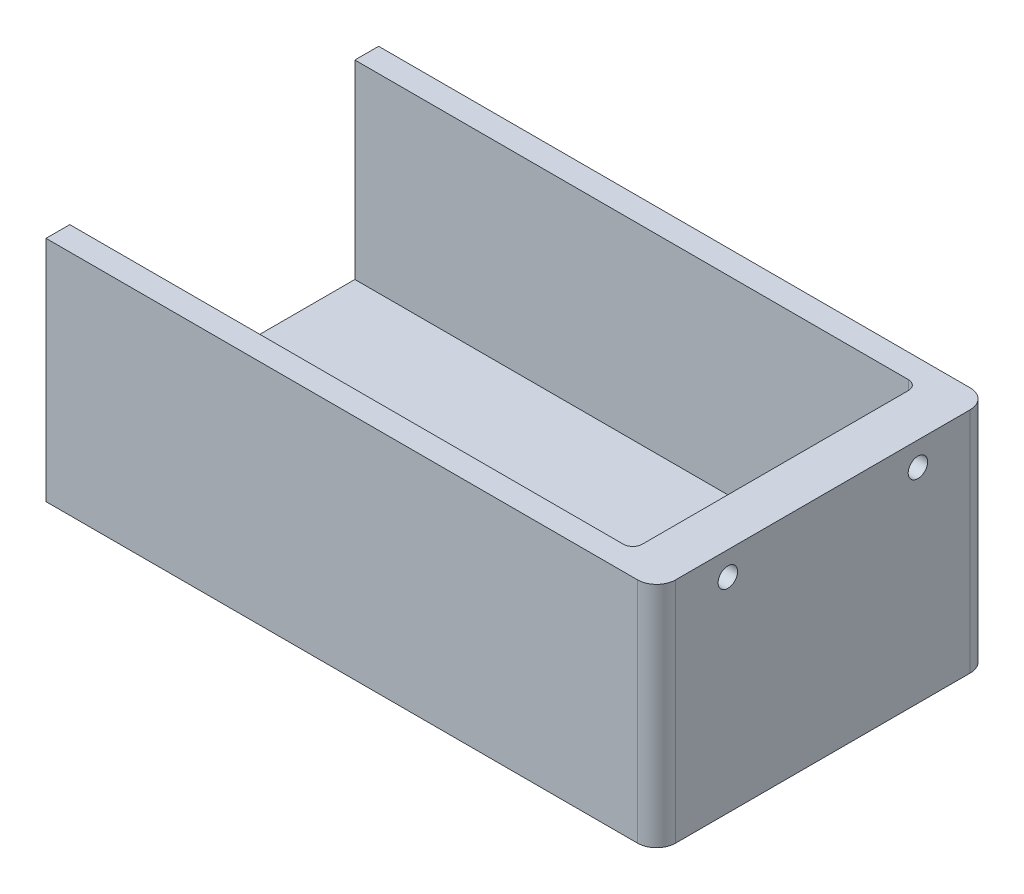
ISO-10303-21;
HEADER;
FILE_DESCRIPTION(('STEP AP214'),'2;1');
FILE_NAME('part.step','',(''),(''),'','','');
FILE_SCHEMA(('AUTOMOTIVE_DESIGN { 1 0 10303 214 1 1 1 1 }'));
ENDSEC;
DATA;
#1=APPLICATION_CONTEXT('core data for automotive mechanical design processes');
#2=APPLICATION_PROTOCOL_DEFINITION('international standard','automotive_design',2000,#1);
#3=PRODUCT_CONTEXT('',#1,'mechanical');
#4=PRODUCT('Part','Part','',(#3));
#5=PRODUCT_RELATED_PRODUCT_CATEGORY('part','',(#4));
#6=PRODUCT_DEFINITION_FORMATION('','',#4);
#7=PRODUCT_DEFINITION_CONTEXT('part definition',#1,'design');
#8=PRODUCT_DEFINITION('design','',#6,#7);
#9=PRODUCT_DEFINITION_SHAPE('','',#8);
#10=(LENGTH_UNIT() NAMED_UNIT(*) SI_UNIT(.MILLI.,.METRE.));
#11=(NAMED_UNIT(*) PLANE_ANGLE_UNIT() SI_UNIT($,.RADIAN.));
#12=(NAMED_UNIT(*) SI_UNIT($,.STERADIAN.) SOLID_ANGLE_UNIT());
#13=UNCERTAINTY_MEASURE_WITH_UNIT(LENGTH_MEASURE(1.E-05),#10,'distance_accuracy_value','');
#14=(GEOMETRIC_REPRESENTATION_CONTEXT(3) GLOBAL_UNCERTAINTY_ASSIGNED_CONTEXT((#13)) GLOBAL_UNIT_ASSIGNED_CONTEXT((#10,
#11,#12)) REPRESENTATION_CONTEXT('',''));
#15=CARTESIAN_POINT('',(0.,0.,0.));
#16=DIRECTION('',(0.,0.,1.));
#17=DIRECTION('',(1.,0.,0.));
#18=AXIS2_PLACEMENT_3D('',#15,#16,#17);
#19=CARTESIAN_POINT('',(0.,0.,0.));
#20=DIRECTION('',(1.,0.,0.));
#21=DIRECTION('',(0.,0.,-1.));
#22=AXIS2_PLACEMENT_3D('',#19,#20,#21);
#23=PLANE('',#22);
#24=CARTESIAN_POINT('',(0.,-5.08000000000003,-25.4));
#25=DIRECTION('',(-1.,0.,0.));
#26=DIRECTION('',(0.,0.,-1.));
#27=AXIS2_PLACEMENT_3D('',#24,#25,#26);
#28=CIRCLE('',#27,2.69);
#29=CARTESIAN_POINT('',(0.,-5.08000000000003,-22.71));
#30=VERTEX_POINT('',#29);
#31=EDGE_CURVE('E306',#30,#30,#28,.T.);
#32=ORIENTED_EDGE('',*,*,#31,.F.);
#33=EDGE_LOOP('',(#32));
#34=FACE_BOUND('',#33,.T.);
#35=CARTESIAN_POINT('',(0.,-5.08,25.4));
#36=DIRECTION('',(-1.,0.,0.));
#37=DIRECTION('',(0.,0.,1.));
#38=AXIS2_PLACEMENT_3D('',#35,#36,#37);
#39=CIRCLE('',#38,2.69);
#40=CARTESIAN_POINT('',(0.,-5.08,28.09));
#41=VERTEX_POINT('',#40);
#42=EDGE_CURVE('E298',#41,#41,#39,.T.);
#43=ORIENTED_EDGE('',*,*,#42,.F.);
#44=EDGE_LOOP('',(#43));
#45=FACE_BOUND('',#44,.T.);
#46=CARTESIAN_POINT('',(0.,-5.08,0.));
#47=DIRECTION('',(-1.,0.,0.));
#48=DIRECTION('',(0.,0.,1.));
#49=AXIS2_PLACEMENT_3D('',#46,#47,#48);
#50=CIRCLE('',#49,2.69);
#51=CARTESIAN_POINT('',(0.,-5.08,2.69));
#52=VERTEX_POINT('',#51);
#53=EDGE_CURVE('E294',#52,#52,#50,.T.);
#54=ORIENTED_EDGE('',*,*,#53,.F.);
#55=EDGE_LOOP('',(#54));
#56=FACE_BOUND('',#55,.T.);
#57=DIRECTION('',(0.,1.,0.));
#58=VECTOR('',#57,1.);
#59=CARTESIAN_POINT('',(0.,50.8,-38.0999999999999));
#60=LINE('',#59,#58);
#61=CARTESIAN_POINT('',(0.,0.,-38.0999999999999));
#62=VERTEX_POINT('',#61);
#63=CARTESIAN_POINT('',(0.,50.8,-38.0999999999999));
#64=VERTEX_POINT('',#63);
#65=EDGE_CURVE('E220',#62,#64,#60,.T.);
#66=ORIENTED_EDGE('',*,*,#65,.T.);
#67=DIRECTION('',(0.,0.,1.));
#68=VECTOR('',#67,1.);
#69=CARTESIAN_POINT('',(0.,50.8,0.));
#70=LINE('',#69,#68);
#71=CARTESIAN_POINT('',(0.,50.8,-44.45));
#72=VERTEX_POINT('',#71);
#73=EDGE_CURVE('E217',#72,#64,#70,.T.);
#74=ORIENTED_EDGE('',*,*,#73,.F.);
#75=DIRECTION('',(0.,1.,0.));
#76=VECTOR('',#75,1.);
#77=CARTESIAN_POINT('',(0.,50.8,-44.45));
#78=LINE('',#77,#76);
#79=CARTESIAN_POINT('',(0.,-10.16,-44.45));
#80=VERTEX_POINT('',#79);
#81=EDGE_CURVE('E213',#80,#72,#78,.T.);
#82=ORIENTED_EDGE('',*,*,#81,.F.);
#83=DIRECTION('',(0.,0.,1.));
#84=VECTOR('',#83,1.);
#85=CARTESIAN_POINT('',(0.,-10.16,0.));
#86=LINE('',#85,#84);
#87=CARTESIAN_POINT('',(0.,-10.16,44.45));
#88=VERTEX_POINT('',#87);
#89=EDGE_CURVE('E11',#80,#88,#86,.T.);
#90=ORIENTED_EDGE('',*,*,#89,.T.);
#91=DIRECTION('',(0.,-1.,0.));
#92=VECTOR('',#91,1.);
#93=CARTESIAN_POINT('',(0.,50.8,44.45));
#94=LINE('',#93,#92);
#95=CARTESIAN_POINT('',(0.,50.8,44.45));
#96=VERTEX_POINT('',#95);
#97=EDGE_CURVE('E66',#96,#88,#94,.T.);
#98=ORIENTED_EDGE('',*,*,#97,.F.);
#99=CARTESIAN_POINT('',(0.,50.8,38.1));
#100=VERTEX_POINT('',#99);
#101=EDGE_CURVE('E216',#100,#96,#70,.T.);
#102=ORIENTED_EDGE('',*,*,#101,.F.);
#103=DIRECTION('',(0.,-1.,0.));
#104=VECTOR('',#103,1.);
#105=CARTESIAN_POINT('',(0.,50.8,38.1));
#106=LINE('',#105,#104);
#107=CARTESIAN_POINT('',(0.,0.,38.1));
#108=VERTEX_POINT('',#107);
#109=EDGE_CURVE('E52',#100,#108,#106,.T.);
#110=ORIENTED_EDGE('',*,*,#109,.T.);
#111=DIRECTION('',(0.,0.,1.));
#112=VECTOR('',#111,1.);
#113=CARTESIAN_POINT('',(0.,0.,0.));
#114=LINE('',#113,#112);
#115=EDGE_CURVE('E46',#62,#108,#114,.T.);
#116=ORIENTED_EDGE('',*,*,#115,.F.);
#117=EDGE_LOOP('',(#66,#74,#82,#90,#98,#102,#110,#116));
#118=FACE_BOUND('',#117,.T.);
#119=ADVANCED_FACE('F43',(#34,#45,#56,#118),#23,.F.);
#120=CARTESIAN_POINT('',(0.,50.8,0.));
#121=DIRECTION('',(0.,-1.,0.));
#122=DIRECTION('',(0.,0.,-1.));
#123=AXIS2_PLACEMENT_3D('',#120,#121,#122);
#124=PLANE('',#123);
#125=DIRECTION('',(-1.,0.,0.));
#126=VECTOR('',#125,1.);
#127=CARTESIAN_POINT('',(-163.195,50.8,-44.45));
#128=LINE('',#127,#126);
#129=CARTESIAN_POINT('',(158.115,50.8,-44.45));
#130=VERTEX_POINT('',#129);
#131=EDGE_CURVE('E158',#130,#72,#128,.T.);
#132=ORIENTED_EDGE('',*,*,#131,.T.);
#133=ORIENTED_EDGE('',*,*,#73,.T.);
#134=DIRECTION('',(-1.,0.,0.));
#135=VECTOR('',#134,1.);
#136=CARTESIAN_POINT('',(-150.495,50.8,-38.0999999999999));
#137=LINE('',#136,#135);
#138=CARTESIAN_POINT('',(147.955,50.8,-38.1));
#139=VERTEX_POINT('',#138);
#140=EDGE_CURVE('E234',#139,#64,#137,.T.);
#141=ORIENTED_EDGE('',*,*,#140,.F.);
#142=CARTESIAN_POINT('',(147.955,50.8,-35.56));
#143=DIRECTION('',(0.,-1.,0.));
#144=DIRECTION('',(0.,0.,-1.));
#145=AXIS2_PLACEMENT_3D('',#142,#143,#144);
#146=CIRCLE('',#145,2.54);
#147=CARTESIAN_POINT('',(150.495,50.8,-35.5599999999999));
#148=VERTEX_POINT('',#147);
#149=EDGE_CURVE('E208',#139,#148,#146,.T.);
#150=ORIENTED_EDGE('',*,*,#149,.T.);
#151=DIRECTION('',(0.,0.,-1.));
#152=VECTOR('',#151,1.);
#153=CARTESIAN_POINT('',(150.495,50.8,38.1));
#154=LINE('',#153,#152);
#155=CARTESIAN_POINT('',(150.495,50.8,35.56));
#156=VERTEX_POINT('',#155);
#157=EDGE_CURVE('E241',#156,#148,#154,.T.);
#158=ORIENTED_EDGE('',*,*,#157,.F.);
#159=CARTESIAN_POINT('',(147.955,50.8,35.56));
#160=DIRECTION('',(0.,-1.,0.));
#161=DIRECTION('',(0.,0.,-1.));
#162=AXIS2_PLACEMENT_3D('',#159,#160,#161);
#163=CIRCLE('',#162,2.54);
#164=CARTESIAN_POINT('',(147.955,50.8,38.1));
#165=VERTEX_POINT('',#164);
#166=EDGE_CURVE('E204',#156,#165,#163,.T.);
#167=ORIENTED_EDGE('',*,*,#166,.T.);
#168=DIRECTION('',(1.,0.,0.));
#169=VECTOR('',#168,1.);
#170=CARTESIAN_POINT('',(-150.495,50.8,38.1));
#171=LINE('',#170,#169);
#172=EDGE_CURVE('E240',#100,#165,#171,.T.);
#173=ORIENTED_EDGE('',*,*,#172,.F.);
#174=ORIENTED_EDGE('',*,*,#101,.T.);
#175=DIRECTION('',(1.,0.,0.));
#176=VECTOR('',#175,1.);
#177=CARTESIAN_POINT('',(-163.195,50.8,44.4500000000001));
#178=LINE('',#177,#176);
#179=CARTESIAN_POINT('',(158.115,50.8,44.45));
#180=VERTEX_POINT('',#179);
#181=EDGE_CURVE('E160',#96,#180,#178,.T.);
#182=ORIENTED_EDGE('',*,*,#181,.T.);
#183=CARTESIAN_POINT('',(158.115,50.8,39.37));
#184=DIRECTION('',(0.,-1.,0.));
#185=DIRECTION('',(0.,0.,-1.));
#186=AXIS2_PLACEMENT_3D('',#183,#184,#185);
#187=CIRCLE('',#186,5.08);
#188=CARTESIAN_POINT('',(163.195,50.8,39.37));
#189=VERTEX_POINT('',#188);
#190=EDGE_CURVE('E175',#180,#189,#187,.F.);
#191=ORIENTED_EDGE('',*,*,#190,.T.);
#192=DIRECTION('',(0.,0.,-1.));
#193=VECTOR('',#192,1.);
#194=CARTESIAN_POINT('',(163.195,50.8,44.45));
#195=LINE('',#194,#193);
#196=CARTESIAN_POINT('',(163.195,50.8,-39.37));
#197=VERTEX_POINT('',#196);
#198=EDGE_CURVE('E245',#189,#197,#195,.T.);
#199=ORIENTED_EDGE('',*,*,#198,.T.);
#200=CARTESIAN_POINT('',(158.115,50.8,-39.37));
#201=DIRECTION('',(0.,-1.,0.));
#202=DIRECTION('',(0.,0.,-1.));
#203=AXIS2_PLACEMENT_3D('',#200,#201,#202);
#204=CIRCLE('',#203,5.08);
#205=EDGE_CURVE('E178',#197,#130,#204,.F.);
#206=ORIENTED_EDGE('',*,*,#205,.T.);
#207=EDGE_LOOP('',(#132,#133,#141,#150,#158,#167,#173,#174,#182,#191,#199,#206));
#208=FACE_BOUND('',#207,.T.);
#209=ADVANCED_FACE('F265',(#208),#124,.F.);
#210=CARTESIAN_POINT('',(163.195,50.8,44.45));
#211=DIRECTION('',(-1.,0.,0.));
#212=DIRECTION('',(0.,0.,1.));
#213=AXIS2_PLACEMENT_3D('',#210,#211,#212);
#214=PLANE('',#213);
#215=CARTESIAN_POINT('',(163.195,44.45,-25.4));
#216=DIRECTION('',(1.,0.,0.));
#217=DIRECTION('',(0.,0.,-1.));
#218=AXIS2_PLACEMENT_3D('',#215,#216,#217);
#219=CIRCLE('',#218,2.6);
#220=CARTESIAN_POINT('',(163.195,44.45,-28.));
#221=VERTEX_POINT('',#220);
#222=EDGE_CURVE('E283',#221,#221,#219,.T.);
#223=ORIENTED_EDGE('',*,*,#222,.F.);
#224=EDGE_LOOP('',(#223));
#225=FACE_BOUND('',#224,.T.);
#226=CARTESIAN_POINT('',(163.195,44.45,25.4));
#227=DIRECTION('',(1.,0.,0.));
#228=DIRECTION('',(0.,0.,1.));
#229=AXIS2_PLACEMENT_3D('',#226,#227,#228);
#230=CIRCLE('',#229,2.6);
#231=CARTESIAN_POINT('',(163.195,44.45,28.));
#232=VERTEX_POINT('',#231);
#233=EDGE_CURVE('E279',#232,#232,#230,.T.);
#234=ORIENTED_EDGE('',*,*,#233,.F.);
#235=EDGE_LOOP('',(#234));
#236=FACE_BOUND('',#235,.T.);
#237=DIRECTION('',(0.,0.,1.));
#238=VECTOR('',#237,1.);
#239=CARTESIAN_POINT('',(163.195,-10.16,-44.45));
#240=LINE('',#239,#238);
#241=CARTESIAN_POINT('',(163.195,-10.16,-39.37));
#242=VERTEX_POINT('',#241);
#243=CARTESIAN_POINT('',(163.195,-10.16,39.37));
#244=VERTEX_POINT('',#243);
#245=EDGE_CURVE('E141',#242,#244,#240,.T.);
#246=ORIENTED_EDGE('',*,*,#245,.F.);
#247=DIRECTION('',(0.,-1.,0.));
#248=VECTOR('',#247,1.);
#249=CARTESIAN_POINT('',(163.195,50.8,-39.37));
#250=LINE('',#249,#248);
#251=EDGE_CURVE('E150',#242,#197,#250,.F.);
#252=ORIENTED_EDGE('',*,*,#251,.T.);
#253=ORIENTED_EDGE('',*,*,#198,.F.);
#254=DIRECTION('',(0.,-1.,0.));
#255=VECTOR('',#254,1.);
#256=CARTESIAN_POINT('',(163.195,50.8,39.37));
#257=LINE('',#256,#255);
#258=EDGE_CURVE('E152',#189,#244,#257,.T.);
#259=ORIENTED_EDGE('',*,*,#258,.T.);
#260=EDGE_LOOP('',(#246,#252,#253,#259));
#261=FACE_BOUND('',#260,.T.);
#262=ADVANCED_FACE('F270',(#225,#236,#261),#214,.F.);
#263=CARTESIAN_POINT('',(-163.195,50.8,-44.45));
#264=DIRECTION('',(0.,0.,1.));
#265=DIRECTION('',(1.,0.,0.));
#266=AXIS2_PLACEMENT_3D('',#263,#264,#265);
#267=PLANE('',#266);
#268=DIRECTION('',(1.,0.,0.));
#269=VECTOR('',#268,1.);
#270=CARTESIAN_POINT('',(-163.195,-10.16,-44.45));
#271=LINE('',#270,#269);
#272=CARTESIAN_POINT('',(158.115,-10.16,-44.45));
#273=VERTEX_POINT('',#272);
#274=EDGE_CURVE('E132',#80,#273,#271,.T.);
#275=ORIENTED_EDGE('',*,*,#274,.F.);
#276=ORIENTED_EDGE('',*,*,#81,.T.);
#277=ORIENTED_EDGE('',*,*,#131,.F.);
#278=DIRECTION('',(0.,-1.,0.));
#279=VECTOR('',#278,1.);
#280=CARTESIAN_POINT('',(158.115,50.8,-44.45));
#281=LINE('',#280,#279);
#282=EDGE_CURVE('E149',#130,#273,#281,.T.);
#283=ORIENTED_EDGE('',*,*,#282,.T.);
#284=EDGE_LOOP('',(#275,#276,#277,#283));
#285=FACE_BOUND('',#284,.T.);
#286=ADVANCED_FACE('F156',(#285),#267,.F.);
#287=CARTESIAN_POINT('',(-163.195,50.8,44.4500000000001));
#288=DIRECTION('',(0.,0.,-1.));
#289=DIRECTION('',(-1.,0.,0.));
#290=AXIS2_PLACEMENT_3D('',#287,#288,#289);
#291=PLANE('',#290);
#292=ORIENTED_EDGE('',*,*,#181,.F.);
#293=ORIENTED_EDGE('',*,*,#97,.T.);
#294=DIRECTION('',(-1.,0.,0.));
#295=VECTOR('',#294,1.);
#296=CARTESIAN_POINT('',(163.195,-10.16,44.45));
#297=LINE('',#296,#295);
#298=CARTESIAN_POINT('',(158.115,-10.16,44.45));
#299=VERTEX_POINT('',#298);
#300=EDGE_CURVE('E258',#299,#88,#297,.T.);
#301=ORIENTED_EDGE('',*,*,#300,.F.);
#302=DIRECTION('',(0.,-1.,0.));
#303=VECTOR('',#302,1.);
#304=CARTESIAN_POINT('',(158.115,50.8,44.45));
#305=LINE('',#304,#303);
#306=EDGE_CURVE('E180',#299,#180,#305,.F.);
#307=ORIENTED_EDGE('',*,*,#306,.T.);
#308=EDGE_LOOP('',(#292,#293,#301,#307));
#309=FACE_BOUND('',#308,.T.);
#310=ADVANCED_FACE('F274',(#309),#291,.F.);
#311=CARTESIAN_POINT('',(150.495,50.8,38.1));
#312=DIRECTION('',(-1.,0.,0.));
#313=DIRECTION('',(0.,0.,1.));
#314=AXIS2_PLACEMENT_3D('',#311,#312,#313);
#315=PLANE('',#314);
#316=CARTESIAN_POINT('',(150.495,44.45,-25.4));
#317=DIRECTION('',(-1.,0.,0.));
#318=DIRECTION('',(0.,0.,1.));
#319=AXIS2_PLACEMENT_3D('',#316,#317,#318);
#320=CIRCLE('',#319,2.6);
#321=CARTESIAN_POINT('',(150.495,44.45,-22.8));
#322=VERTEX_POINT('',#321);
#323=EDGE_CURVE('E142',#322,#322,#320,.F.);
#324=ORIENTED_EDGE('',*,*,#323,.T.);
#325=EDGE_LOOP('',(#324));
#326=FACE_BOUND('',#325,.T.);
#327=CARTESIAN_POINT('',(150.495,44.45,25.4));
#328=DIRECTION('',(-1.,0.,0.));
#329=DIRECTION('',(0.,0.,1.));
#330=AXIS2_PLACEMENT_3D('',#327,#328,#329);
#331=CIRCLE('',#330,2.6);
#332=CARTESIAN_POINT('',(150.495,44.45,28.));
#333=VERTEX_POINT('',#332);
#334=EDGE_CURVE('E284',#333,#333,#331,.F.);
#335=ORIENTED_EDGE('',*,*,#334,.T.);
#336=EDGE_LOOP('',(#335));
#337=FACE_BOUND('',#336,.T.);
#338=DIRECTION('',(0.,0.,-1.));
#339=VECTOR('',#338,1.);
#340=CARTESIAN_POINT('',(150.495,0.,38.1));
#341=LINE('',#340,#339);
#342=CARTESIAN_POINT('',(150.495,0.,35.56));
#343=VERTEX_POINT('',#342);
#344=CARTESIAN_POINT('',(150.495,0.,-35.5599999999999));
#345=VERTEX_POINT('',#344);
#346=EDGE_CURVE('E253',#343,#345,#341,.T.);
#347=ORIENTED_EDGE('',*,*,#346,.F.);
#348=DIRECTION('',(0.,-1.,0.));
#349=VECTOR('',#348,1.);
#350=CARTESIAN_POINT('',(150.495,50.8,35.56));
#351=LINE('',#350,#349);
#352=EDGE_CURVE('E198',#343,#156,#351,.F.);
#353=ORIENTED_EDGE('',*,*,#352,.T.);
#354=ORIENTED_EDGE('',*,*,#157,.T.);
#355=DIRECTION('',(0.,-1.,0.));
#356=VECTOR('',#355,1.);
#357=CARTESIAN_POINT('',(150.495,0.,-35.56));
#358=LINE('',#357,#356);
#359=EDGE_CURVE('E194',#148,#345,#358,.T.);
#360=ORIENTED_EDGE('',*,*,#359,.T.);
#361=EDGE_LOOP('',(#347,#353,#354,#360));
#362=FACE_BOUND('',#361,.T.);
#363=ADVANCED_FACE('F347',(#326,#337,#362),#315,.T.);
#364=CARTESIAN_POINT('',(-150.495,50.8,-38.0999999999999));
#365=DIRECTION('',(0.,0.,1.));
#366=DIRECTION('',(1.,0.,0.));
#367=AXIS2_PLACEMENT_3D('',#364,#365,#366);
#368=PLANE('',#367);
#369=ORIENTED_EDGE('',*,*,#65,.F.);
#370=DIRECTION('',(-1.,0.,0.));
#371=VECTOR('',#370,1.);
#372=CARTESIAN_POINT('',(-150.495,0.,-38.0999999999999));
#373=LINE('',#372,#371);
#374=CARTESIAN_POINT('',(147.955,0.,-38.1));
#375=VERTEX_POINT('',#374);
#376=EDGE_CURVE('E257',#375,#62,#373,.T.);
#377=ORIENTED_EDGE('',*,*,#376,.F.);
#378=DIRECTION('',(0.,-1.,0.));
#379=VECTOR('',#378,1.);
#380=CARTESIAN_POINT('',(147.955,50.8,-38.1));
#381=LINE('',#380,#379);
#382=EDGE_CURVE('E201',#375,#139,#381,.F.);
#383=ORIENTED_EDGE('',*,*,#382,.T.);
#384=ORIENTED_EDGE('',*,*,#140,.T.);
#385=EDGE_LOOP('',(#369,#377,#383,#384));
#386=FACE_BOUND('',#385,.T.);
#387=ADVANCED_FACE('F235',(#386),#368,.T.);
#388=CARTESIAN_POINT('',(-150.495,50.8,38.1));
#389=DIRECTION('',(0.,0.,-1.));
#390=DIRECTION('',(-1.,0.,0.));
#391=AXIS2_PLACEMENT_3D('',#388,#389,#390);
#392=PLANE('',#391);
#393=ORIENTED_EDGE('',*,*,#109,.F.);
#394=ORIENTED_EDGE('',*,*,#172,.T.);
#395=DIRECTION('',(0.,-1.,0.));
#396=VECTOR('',#395,1.);
#397=CARTESIAN_POINT('',(147.955,0.,38.1));
#398=LINE('',#397,#396);
#399=CARTESIAN_POINT('',(147.955,0.,38.1));
#400=VERTEX_POINT('',#399);
#401=EDGE_CURVE('E184',#165,#400,#398,.T.);
#402=ORIENTED_EDGE('',*,*,#401,.T.);
#403=DIRECTION('',(1.,0.,0.));
#404=VECTOR('',#403,1.);
#405=CARTESIAN_POINT('',(-150.495,0.,38.1));
#406=LINE('',#405,#404);
#407=EDGE_CURVE('E249',#108,#400,#406,.T.);
#408=ORIENTED_EDGE('',*,*,#407,.F.);
#409=EDGE_LOOP('',(#393,#394,#402,#408));
#410=FACE_BOUND('',#409,.T.);
#411=ADVANCED_FACE('F374',(#410),#392,.T.);
#412=CARTESIAN_POINT('',(0.,0.,0.));
#413=DIRECTION('',(0.,-1.,0.));
#414=DIRECTION('',(0.,0.,-1.));
#415=AXIS2_PLACEMENT_3D('',#412,#413,#414);
#416=PLANE('',#415);
#417=ORIENTED_EDGE('',*,*,#376,.T.);
#418=ORIENTED_EDGE('',*,*,#115,.T.);
#419=ORIENTED_EDGE('',*,*,#407,.T.);
#420=CARTESIAN_POINT('',(147.955,0.,35.56));
#421=DIRECTION('',(0.,-1.,0.));
#422=DIRECTION('',(0.,0.,-1.));
#423=AXIS2_PLACEMENT_3D('',#420,#421,#422);
#424=CIRCLE('',#423,2.54);
#425=EDGE_CURVE('E191',#400,#343,#424,.F.);
#426=ORIENTED_EDGE('',*,*,#425,.T.);
#427=ORIENTED_EDGE('',*,*,#346,.T.);
#428=CARTESIAN_POINT('',(147.955,0.,-35.56));
#429=DIRECTION('',(0.,-1.,0.));
#430=DIRECTION('',(0.,0.,-1.));
#431=AXIS2_PLACEMENT_3D('',#428,#429,#430);
#432=CIRCLE('',#431,2.54);
#433=EDGE_CURVE('E188',#345,#375,#432,.F.);
#434=ORIENTED_EDGE('',*,*,#433,.T.);
#435=EDGE_LOOP('',(#417,#418,#419,#426,#427,#434));
#436=FACE_BOUND('',#435,.T.);
#437=ADVANCED_FACE('F371',(#436),#416,.F.);
#438=CARTESIAN_POINT('',(0.,-10.16,0.));
#439=DIRECTION('',(0.,-1.,0.));
#440=DIRECTION('',(0.,0.,-1.));
#441=AXIS2_PLACEMENT_3D('',#438,#439,#440);
#442=PLANE('',#441);
#443=ORIENTED_EDGE('',*,*,#89,.F.);
#444=ORIENTED_EDGE('',*,*,#274,.T.);
#445=CARTESIAN_POINT('',(158.115,-10.16,-39.37));
#446=DIRECTION('',(0.,-1.,0.));
#447=DIRECTION('',(0.,0.,-1.));
#448=AXIS2_PLACEMENT_3D('',#445,#446,#447);
#449=CIRCLE('',#448,5.08);
#450=EDGE_CURVE('E136',#273,#242,#449,.T.);
#451=ORIENTED_EDGE('',*,*,#450,.T.);
#452=ORIENTED_EDGE('',*,*,#245,.T.);
#453=CARTESIAN_POINT('',(158.115,-10.16,39.37));
#454=DIRECTION('',(0.,-1.,0.));
#455=DIRECTION('',(0.,0.,-1.));
#456=AXIS2_PLACEMENT_3D('',#453,#454,#455);
#457=CIRCLE('',#456,5.08);
#458=EDGE_CURVE('E153',#244,#299,#457,.T.);
#459=ORIENTED_EDGE('',*,*,#458,.T.);
#460=ORIENTED_EDGE('',*,*,#300,.T.);
#461=EDGE_LOOP('',(#443,#444,#451,#452,#459,#460));
#462=FACE_BOUND('',#461,.T.);
#463=ADVANCED_FACE('F134',(#462),#442,.T.);
#464=CARTESIAN_POINT('',(143.14108947566,44.45,25.4));
#465=DIRECTION('',(1.,0.,0.));
#466=DIRECTION('',(0.,0.,-1.));
#467=AXIS2_PLACEMENT_3D('',#464,#465,#466);
#468=CYLINDRICAL_SURFACE('',#467,2.6);
#469=ORIENTED_EDGE('',*,*,#233,.T.);
#470=EDGE_LOOP('',(#469));
#471=FACE_BOUND('',#470,.T.);
#472=ORIENTED_EDGE('',*,*,#334,.F.);
#473=EDGE_LOOP('',(#472));
#474=FACE_BOUND('',#473,.T.);
#475=ADVANCED_FACE('F386',(#471,#474),#468,.F.);
#476=CARTESIAN_POINT('',(143.14108947566,44.45,-25.4));
#477=DIRECTION('',(1.,0.,0.));
#478=DIRECTION('',(0.,0.,-1.));
#479=AXIS2_PLACEMENT_3D('',#476,#477,#478);
#480=CYLINDRICAL_SURFACE('',#479,2.6);
#481=ORIENTED_EDGE('',*,*,#222,.T.);
#482=EDGE_LOOP('',(#481));
#483=FACE_BOUND('',#482,.T.);
#484=ORIENTED_EDGE('',*,*,#323,.F.);
#485=EDGE_LOOP('',(#484));
#486=FACE_BOUND('',#485,.T.);
#487=ADVANCED_FACE('F355',(#483,#486),#480,.F.);
#488=CARTESIAN_POINT('',(158.115,50.8,-39.37));
#489=DIRECTION('',(0.,-1.,0.));
#490=DIRECTION('',(0.,0.,-1.));
#491=AXIS2_PLACEMENT_3D('',#488,#489,#490);
#492=CYLINDRICAL_SURFACE('',#491,5.08);
#493=ORIENTED_EDGE('',*,*,#205,.F.);
#494=ORIENTED_EDGE('',*,*,#251,.F.);
#495=ORIENTED_EDGE('',*,*,#450,.F.);
#496=ORIENTED_EDGE('',*,*,#282,.F.);
#497=EDGE_LOOP('',(#493,#494,#495,#496));
#498=FACE_BOUND('',#497,.T.);
#499=ADVANCED_FACE('F148',(#498),#492,.T.);
#500=CARTESIAN_POINT('',(158.115,50.8,39.37));
#501=DIRECTION('',(0.,-1.,0.));
#502=DIRECTION('',(0.,0.,-1.));
#503=AXIS2_PLACEMENT_3D('',#500,#501,#502);
#504=CYLINDRICAL_SURFACE('',#503,5.08);
#505=ORIENTED_EDGE('',*,*,#190,.F.);
#506=ORIENTED_EDGE('',*,*,#306,.F.);
#507=ORIENTED_EDGE('',*,*,#458,.F.);
#508=ORIENTED_EDGE('',*,*,#258,.F.);
#509=EDGE_LOOP('',(#505,#506,#507,#508));
#510=FACE_BOUND('',#509,.T.);
#511=ADVANCED_FACE('F272',(#510),#504,.T.);
#512=CARTESIAN_POINT('',(147.955,50.8,35.56));
#513=DIRECTION('',(0.,1.,0.));
#514=DIRECTION('',(0.,0.,1.));
#515=AXIS2_PLACEMENT_3D('',#512,#513,#514);
#516=CYLINDRICAL_SURFACE('',#515,2.54);
#517=ORIENTED_EDGE('',*,*,#166,.F.);
#518=ORIENTED_EDGE('',*,*,#352,.F.);
#519=ORIENTED_EDGE('',*,*,#425,.F.);
#520=ORIENTED_EDGE('',*,*,#401,.F.);
#521=EDGE_LOOP('',(#517,#518,#519,#520));
#522=FACE_BOUND('',#521,.T.);
#523=ADVANCED_FACE('F335',(#522),#516,.F.);
#524=CARTESIAN_POINT('',(147.955,50.8,-35.56));
#525=DIRECTION('',(0.,1.,0.));
#526=DIRECTION('',(0.,0.,1.));
#527=AXIS2_PLACEMENT_3D('',#524,#525,#526);
#528=CYLINDRICAL_SURFACE('',#527,2.54);
#529=ORIENTED_EDGE('',*,*,#149,.F.);
#530=ORIENTED_EDGE('',*,*,#382,.F.);
#531=ORIENTED_EDGE('',*,*,#433,.F.);
#532=ORIENTED_EDGE('',*,*,#359,.F.);
#533=EDGE_LOOP('',(#529,#530,#531,#532));
#534=FACE_BOUND('',#533,.T.);
#535=ADVANCED_FACE('F322',(#534),#528,.F.);
#536=CARTESIAN_POINT('',(15.24,-5.08,0.));
#537=DIRECTION('',(-1.,0.,0.));
#538=DIRECTION('',(0.,0.,1.));
#539=AXIS2_PLACEMENT_3D('',#536,#537,#538);
#540=CYLINDRICAL_SURFACE('',#539,2.69);
#541=CARTESIAN_POINT('',(15.24,-5.08,0.));
#542=DIRECTION('',(-1.,0.,0.));
#543=DIRECTION('',(0.,0.,1.));
#544=AXIS2_PLACEMENT_3D('',#541,#542,#543);
#545=CIRCLE('',#544,2.69);
#546=CARTESIAN_POINT('',(15.24,-5.08,2.69));
#547=VERTEX_POINT('',#546);
#548=EDGE_CURVE('E287',#547,#547,#545,.T.);
#549=CARTESIAN_POINT('',(15.24,-5.08,2.69));
#550=CARTESIAN_POINT('',(15.08125,-5.08,2.69));
#551=CARTESIAN_POINT('',(14.9225,-5.08,2.69));
#552=CARTESIAN_POINT('',(14.605,-5.08,2.69));
#553=CARTESIAN_POINT('',(14.44625,-5.08,2.69));
#554=CARTESIAN_POINT('',(14.12875,-5.08,2.69));
#555=CARTESIAN_POINT('',(13.97,-5.08,2.69));
#556=CARTESIAN_POINT('',(13.6525,-5.08,2.69));
#557=CARTESIAN_POINT('',(13.49375,-5.08,2.69));
#558=CARTESIAN_POINT('',(13.17625,-5.08,2.69));
#559=CARTESIAN_POINT('',(13.0175,-5.08,2.69));
#560=CARTESIAN_POINT('',(12.7,-5.08,2.69));
#561=CARTESIAN_POINT('',(12.54125,-5.08,2.69));
#562=CARTESIAN_POINT('',(12.22375,-5.08,2.69));
#563=CARTESIAN_POINT('',(12.065,-5.08,2.69));
#564=CARTESIAN_POINT('',(11.7475,-5.08,2.69));
#565=CARTESIAN_POINT('',(11.58875,-5.08,2.69));
#566=CARTESIAN_POINT('',(11.27125,-5.08,2.69));
#567=CARTESIAN_POINT('',(11.1125,-5.08,2.69));
#568=CARTESIAN_POINT('',(10.795,-5.08,2.69));
#569=CARTESIAN_POINT('',(10.63625,-5.08,2.69));
#570=CARTESIAN_POINT('',(10.31875,-5.08,2.69));
#571=CARTESIAN_POINT('',(10.16,-5.08,2.69));
#572=CARTESIAN_POINT('',(9.8425,-5.08,2.69));
#573=CARTESIAN_POINT('',(9.68375,-5.08,2.69));
#574=CARTESIAN_POINT('',(9.36625,-5.08,2.69));
#575=CARTESIAN_POINT('',(9.2075,-5.08,2.69));
#576=CARTESIAN_POINT('',(8.89,-5.08,2.69));
#577=CARTESIAN_POINT('',(8.73125,-5.08,2.69));
#578=CARTESIAN_POINT('',(8.41375,-5.08,2.69));
#579=CARTESIAN_POINT('',(8.255,-5.08,2.69));
#580=CARTESIAN_POINT('',(7.9375,-5.08,2.69));
#581=CARTESIAN_POINT('',(7.77875,-5.08,2.69));
#582=CARTESIAN_POINT('',(7.46125,-5.08,2.69));
#583=CARTESIAN_POINT('',(7.3025,-5.08,2.69));
#584=CARTESIAN_POINT('',(6.985,-5.08,2.69));
#585=CARTESIAN_POINT('',(6.82625,-5.08,2.69));
#586=CARTESIAN_POINT('',(6.50875,-5.08,2.69));
#587=CARTESIAN_POINT('',(6.35,-5.08,2.69));
#588=CARTESIAN_POINT('',(6.0325,-5.08,2.69));
#589=CARTESIAN_POINT('',(5.87375,-5.08,2.69));
#590=CARTESIAN_POINT('',(5.55625,-5.08,2.69));
#591=CARTESIAN_POINT('',(5.3975,-5.08,2.69));
#592=CARTESIAN_POINT('',(5.08,-5.08,2.69));
#593=CARTESIAN_POINT('',(4.92125,-5.08,2.69));
#594=CARTESIAN_POINT('',(4.60375,-5.08,2.69));
#595=CARTESIAN_POINT('',(4.445,-5.08,2.69));
#596=CARTESIAN_POINT('',(4.1275,-5.08,2.69));
#597=CARTESIAN_POINT('',(3.96875,-5.08,2.69));
#598=CARTESIAN_POINT('',(3.65125,-5.08,2.69));
#599=CARTESIAN_POINT('',(3.4925,-5.08,2.69));
#600=CARTESIAN_POINT('',(3.175,-5.08,2.69));
#601=CARTESIAN_POINT('',(3.01625,-5.08,2.69));
#602=CARTESIAN_POINT('',(2.69875,-5.08,2.69));
#603=CARTESIAN_POINT('',(2.54,-5.08,2.69));
#604=CARTESIAN_POINT('',(2.2225,-5.08,2.69));
#605=CARTESIAN_POINT('',(2.06375,-5.08,2.69));
#606=CARTESIAN_POINT('',(1.74625,-5.08,2.69));
#607=CARTESIAN_POINT('',(1.5875,-5.08,2.69));
#608=CARTESIAN_POINT('',(1.27,-5.08,2.69));
#609=CARTESIAN_POINT('',(1.11125,-5.08,2.69));
#610=CARTESIAN_POINT('',(0.79375,-5.08,2.69));
#611=CARTESIAN_POINT('',(0.634999999999999,-5.08,2.69));
#612=CARTESIAN_POINT('',(0.3175,-5.08,2.69));
#613=CARTESIAN_POINT('',(0.15875,-5.08,2.69));
#614=CARTESIAN_POINT('',(0.,-5.08,2.69));
#615=B_SPLINE_CURVE_WITH_KNOTS('',3,(#549,#550,#551,#552,#553,#554,#555,#556,#557,#558,#559,
#560,#561,#562,#563,#564,#565,#566,#567,#568,#569,#570,#571,#572,#573,#574,#575,#576,#577,#578,
#579,#580,#581,#582,#583,#584,#585,#586,#587,#588,#589,#590,#591,#592,#593,#594,#595,#596,#597,
#598,#599,#600,#601,#602,#603,#604,#605,#606,#607,#608,#609,#610,#611,#612,#613,#614),
.UNSPECIFIED.,.F.,.F.,(4,2,2,2,2,2,2,2,2,2,2,2,2,2,2,2,2,2,2,2,2,2,2,2,2,2,2,2,2,2,2,2,4),(0.,
0.476250000000001,0.9525,1.42875,1.905,2.38125,2.8575,3.33375,3.81,4.28625,4.7625,5.23875,5.715,
6.19125,6.6675,7.14375,7.62,8.09625,8.5725,9.04875,9.525,10.00125,10.4775,10.95375,11.43,
11.90625,12.3825,12.85875,13.335,13.81125,14.2875,14.76375,15.24),.UNSPECIFIED.);
#616=EDGE_CURVE('BSEAM325',#547,#52,#615,.T.);
#617=ORIENTED_EDGE('',*,*,#548,.F.);
#618=ORIENTED_EDGE('',*,*,#53,.T.);
#619=ORIENTED_EDGE('',*,*,#616,.T.);
#620=ORIENTED_EDGE('',*,*,#616,.F.);
#621=EDGE_LOOP('',(#617,#619,#618,#620));
#622=FACE_BOUND('',#621,.T.);
#623=ADVANCED_FACE('F325',(#622),#540,.F.);
#624=CARTESIAN_POINT('',(15.24,-5.08,0.));
#625=DIRECTION('',(-1.,0.,0.));
#626=DIRECTION('',(0.,0.,1.));
#627=AXIS2_PLACEMENT_3D('',#624,#625,#626);
#628=PLANE('',#627);
#629=ORIENTED_EDGE('',*,*,#548,.T.);
#630=EDGE_LOOP('',(#629));
#631=FACE_BOUND('',#630,.T.);
#632=ADVANCED_FACE('F327',(#631),#628,.T.);
#633=CARTESIAN_POINT('',(15.24,-5.08,25.4));
#634=DIRECTION('',(-1.,0.,0.));
#635=DIRECTION('',(0.,0.,1.));
#636=AXIS2_PLACEMENT_3D('',#633,#634,#635);
#637=CYLINDRICAL_SURFACE('',#636,2.69);
#638=CARTESIAN_POINT('',(15.24,-5.08,25.4));
#639=DIRECTION('',(-1.,0.,0.));
#640=DIRECTION('',(0.,0.,1.));
#641=AXIS2_PLACEMENT_3D('',#638,#639,#640);
#642=CIRCLE('',#641,2.69);
#643=CARTESIAN_POINT('',(15.24,-5.08,28.09));
#644=VERTEX_POINT('',#643);
#645=EDGE_CURVE('E310',#644,#644,#642,.T.);
#646=CARTESIAN_POINT('',(15.24,-5.08,28.09));
#647=CARTESIAN_POINT('',(15.08125,-5.08,28.09));
#648=CARTESIAN_POINT('',(14.9225,-5.08,28.09));
#649=CARTESIAN_POINT('',(14.605,-5.08,28.09));
#650=CARTESIAN_POINT('',(14.44625,-5.08,28.09));
#651=CARTESIAN_POINT('',(14.12875,-5.08,28.09));
#652=CARTESIAN_POINT('',(13.97,-5.08,28.09));
#653=CARTESIAN_POINT('',(13.6525,-5.08,28.09));
#654=CARTESIAN_POINT('',(13.49375,-5.08,28.09));
#655=CARTESIAN_POINT('',(13.17625,-5.08,28.09));
#656=CARTESIAN_POINT('',(13.0175,-5.08,28.09));
#657=CARTESIAN_POINT('',(12.7,-5.08,28.09));
#658=CARTESIAN_POINT('',(12.54125,-5.08,28.09));
#659=CARTESIAN_POINT('',(12.22375,-5.08,28.09));
#660=CARTESIAN_POINT('',(12.065,-5.08,28.09));
#661=CARTESIAN_POINT('',(11.7475,-5.08,28.09));
#662=CARTESIAN_POINT('',(11.58875,-5.08,28.09));
#663=CARTESIAN_POINT('',(11.27125,-5.08,28.09));
#664=CARTESIAN_POINT('',(11.1125,-5.08,28.09));
#665=CARTESIAN_POINT('',(10.795,-5.08,28.09));
#666=CARTESIAN_POINT('',(10.63625,-5.08,28.09));
#667=CARTESIAN_POINT('',(10.31875,-5.08,28.09));
#668=CARTESIAN_POINT('',(10.16,-5.08,28.09));
#669=CARTESIAN_POINT('',(9.8425,-5.08,28.09));
#670=CARTESIAN_POINT('',(9.68375,-5.08,28.09));
#671=CARTESIAN_POINT('',(9.36625,-5.08,28.09));
#672=CARTESIAN_POINT('',(9.2075,-5.08,28.09));
#673=CARTESIAN_POINT('',(8.89,-5.08,28.09));
#674=CARTESIAN_POINT('',(8.73125,-5.08,28.09));
#675=CARTESIAN_POINT('',(8.41375,-5.08,28.09));
#676=CARTESIAN_POINT('',(8.255,-5.08,28.09));
#677=CARTESIAN_POINT('',(7.9375,-5.08,28.09));
#678=CARTESIAN_POINT('',(7.77875,-5.08,28.09));
#679=CARTESIAN_POINT('',(7.46125,-5.08,28.09));
#680=CARTESIAN_POINT('',(7.3025,-5.08,28.09));
#681=CARTESIAN_POINT('',(6.985,-5.08,28.09));
#682=CARTESIAN_POINT('',(6.82625,-5.08,28.09));
#683=CARTESIAN_POINT('',(6.50875,-5.08,28.09));
#684=CARTESIAN_POINT('',(6.35,-5.08,28.09));
#685=CARTESIAN_POINT('',(6.0325,-5.08,28.09));
#686=CARTESIAN_POINT('',(5.87375,-5.08,28.09));
#687=CARTESIAN_POINT('',(5.55625,-5.08,28.09));
#688=CARTESIAN_POINT('',(5.3975,-5.08,28.09));
#689=CARTESIAN_POINT('',(5.08,-5.08,28.09));
#690=CARTESIAN_POINT('',(4.92125,-5.08,28.09));
#691=CARTESIAN_POINT('',(4.60375,-5.08,28.09));
#692=CARTESIAN_POINT('',(4.445,-5.08,28.09));
#693=CARTESIAN_POINT('',(4.1275,-5.08,28.09));
#694=CARTESIAN_POINT('',(3.96875,-5.08,28.09));
#695=CARTESIAN_POINT('',(3.65125,-5.08,28.09));
#696=CARTESIAN_POINT('',(3.4925,-5.08,28.09));
#697=CARTESIAN_POINT('',(3.175,-5.08,28.09));
#698=CARTESIAN_POINT('',(3.01625,-5.08,28.09));
#699=CARTESIAN_POINT('',(2.69875,-5.08,28.09));
#700=CARTESIAN_POINT('',(2.54,-5.08,28.09));
#701=CARTESIAN_POINT('',(2.2225,-5.08,28.09));
#702=CARTESIAN_POINT('',(2.06375,-5.08,28.09));
#703=CARTESIAN_POINT('',(1.74625,-5.08,28.09));
#704=CARTESIAN_POINT('',(1.5875,-5.08,28.09));
#705=CARTESIAN_POINT('',(1.27,-5.08,28.09));
#706=CARTESIAN_POINT('',(1.11125,-5.08,28.09));
#707=CARTESIAN_POINT('',(0.79375,-5.08,28.09));
#708=CARTESIAN_POINT('',(0.634999999999999,-5.08,28.09));
#709=CARTESIAN_POINT('',(0.3175,-5.08,28.09));
#710=CARTESIAN_POINT('',(0.15875,-5.08,28.09));
#711=CARTESIAN_POINT('',(0.,-5.08,28.09));
#712=B_SPLINE_CURVE_WITH_KNOTS('',3,(#646,#647,#648,#649,#650,#651,#652,#653,#654,#655,#656,
#657,#658,#659,#660,#661,#662,#663,#664,#665,#666,#667,#668,#669,#670,#671,#672,#673,#674,#675,
#676,#677,#678,#679,#680,#681,#682,#683,#684,#685,#686,#687,#688,#689,#690,#691,#692,#693,#694,
#695,#696,#697,#698,#699,#700,#701,#702,#703,#704,#705,#706,#707,#708,#709,#710,#711),
.UNSPECIFIED.,.F.,.F.,(4,2,2,2,2,2,2,2,2,2,2,2,2,2,2,2,2,2,2,2,2,2,2,2,2,2,2,2,2,2,2,2,4),(0.,
0.476250000000001,0.9525,1.42875,1.905,2.38125,2.8575,3.33375,3.81,4.28625,4.7625,5.23875,5.715,
6.19125,6.6675,7.14375,7.62,8.09625,8.5725,9.04875,9.525,10.00125,10.4775,10.95375,11.43,
11.90625,12.3825,12.85875,13.335,13.81125,14.2875,14.76375,15.24),.UNSPECIFIED.);
#713=EDGE_CURVE('BSEAM317',#644,#41,#712,.T.);
#714=ORIENTED_EDGE('',*,*,#645,.F.);
#715=ORIENTED_EDGE('',*,*,#42,.T.);
#716=ORIENTED_EDGE('',*,*,#713,.T.);
#717=ORIENTED_EDGE('',*,*,#713,.F.);
#718=EDGE_LOOP('',(#714,#716,#715,#717));
#719=FACE_BOUND('',#718,.T.);
#720=ADVANCED_FACE('F317',(#719),#637,.F.);
#721=CARTESIAN_POINT('',(15.24,-5.08,25.4));
#722=DIRECTION('',(-1.,0.,0.));
#723=DIRECTION('',(0.,0.,1.));
#724=AXIS2_PLACEMENT_3D('',#721,#722,#723);
#725=PLANE('',#724);
#726=ORIENTED_EDGE('',*,*,#645,.T.);
#727=EDGE_LOOP('',(#726));
#728=FACE_BOUND('',#727,.T.);
#729=ADVANCED_FACE('F456',(#728),#725,.T.);
#730=CARTESIAN_POINT('',(15.24,-5.08000000000003,-25.4));
#731=DIRECTION('',(-1.,0.,0.));
#732=DIRECTION('',(0.,0.,1.));
#733=AXIS2_PLACEMENT_3D('',#730,#731,#732);
#734=CYLINDRICAL_SURFACE('',#733,2.69);
#735=CARTESIAN_POINT('',(15.24,-5.08000000000003,-25.4));
#736=DIRECTION('',(-1.,0.,0.));
#737=DIRECTION('',(0.,0.,-1.));
#738=AXIS2_PLACEMENT_3D('',#735,#736,#737);
#739=CIRCLE('',#738,2.69);
#740=CARTESIAN_POINT('',(15.24,-5.08000000000003,-22.71));
#741=VERTEX_POINT('',#740);
#742=EDGE_CURVE('E302',#741,#741,#739,.T.);
#743=CARTESIAN_POINT('',(15.24,-5.08000000000003,-22.71));
#744=CARTESIAN_POINT('',(15.08125,-5.08000000000003,-22.71));
#745=CARTESIAN_POINT('',(14.9225,-5.08000000000003,-22.71));
#746=CARTESIAN_POINT('',(14.605,-5.08000000000003,-22.71));
#747=CARTESIAN_POINT('',(14.44625,-5.08000000000003,-22.71));
#748=CARTESIAN_POINT('',(14.12875,-5.08000000000003,-22.71));
#749=CARTESIAN_POINT('',(13.97,-5.08000000000003,-22.71));
#750=CARTESIAN_POINT('',(13.6525,-5.08000000000003,-22.71));
#751=CARTESIAN_POINT('',(13.49375,-5.08000000000003,-22.71));
#752=CARTESIAN_POINT('',(13.17625,-5.08000000000003,-22.71));
#753=CARTESIAN_POINT('',(13.0175,-5.08000000000003,-22.71));
#754=CARTESIAN_POINT('',(12.7,-5.08000000000003,-22.71));
#755=CARTESIAN_POINT('',(12.54125,-5.08000000000003,-22.71));
#756=CARTESIAN_POINT('',(12.22375,-5.08000000000003,-22.71));
#757=CARTESIAN_POINT('',(12.065,-5.08000000000003,-22.71));
#758=CARTESIAN_POINT('',(11.7475,-5.08000000000003,-22.71));
#759=CARTESIAN_POINT('',(11.58875,-5.08000000000003,-22.71));
#760=CARTESIAN_POINT('',(11.27125,-5.08000000000003,-22.71));
#761=CARTESIAN_POINT('',(11.1125,-5.08000000000003,-22.71));
#762=CARTESIAN_POINT('',(10.795,-5.08000000000003,-22.71));
#763=CARTESIAN_POINT('',(10.63625,-5.08000000000003,-22.71));
#764=CARTESIAN_POINT('',(10.31875,-5.08000000000003,-22.71));
#765=CARTESIAN_POINT('',(10.16,-5.08000000000003,-22.71));
#766=CARTESIAN_POINT('',(9.8425,-5.08000000000003,-22.71));
#767=CARTESIAN_POINT('',(9.68375,-5.08000000000003,-22.71));
#768=CARTESIAN_POINT('',(9.36625,-5.08000000000003,-22.71));
#769=CARTESIAN_POINT('',(9.2075,-5.08000000000003,-22.71));
#770=CARTESIAN_POINT('',(8.89,-5.08000000000003,-22.71));
#771=CARTESIAN_POINT('',(8.73125,-5.08000000000003,-22.71));
#772=CARTESIAN_POINT('',(8.41375,-5.08000000000003,-22.71));
#773=CARTESIAN_POINT('',(8.255,-5.08000000000003,-22.71));
#774=CARTESIAN_POINT('',(7.9375,-5.08000000000003,-22.71));
#775=CARTESIAN_POINT('',(7.77875,-5.08000000000003,-22.71));
#776=CARTESIAN_POINT('',(7.46125,-5.08000000000003,-22.71));
#777=CARTESIAN_POINT('',(7.3025,-5.08000000000003,-22.71));
#778=CARTESIAN_POINT('',(6.985,-5.08000000000003,-22.71));
#779=CARTESIAN_POINT('',(6.82625,-5.08000000000003,-22.71));
#780=CARTESIAN_POINT('',(6.50875,-5.08000000000003,-22.71));
#781=CARTESIAN_POINT('',(6.35,-5.08000000000003,-22.71));
#782=CARTESIAN_POINT('',(6.0325,-5.08000000000003,-22.71));
#783=CARTESIAN_POINT('',(5.87375,-5.08000000000003,-22.71));
#784=CARTESIAN_POINT('',(5.55625,-5.08000000000003,-22.71));
#785=CARTESIAN_POINT('',(5.3975,-5.08000000000003,-22.71));
#786=CARTESIAN_POINT('',(5.08,-5.08000000000003,-22.71));
#787=CARTESIAN_POINT('',(4.92125,-5.08000000000003,-22.71));
#788=CARTESIAN_POINT('',(4.60375,-5.08000000000003,-22.71));
#789=CARTESIAN_POINT('',(4.445,-5.08000000000003,-22.71));
#790=CARTESIAN_POINT('',(4.1275,-5.08000000000003,-22.71));
#791=CARTESIAN_POINT('',(3.96875,-5.08000000000003,-22.71));
#792=CARTESIAN_POINT('',(3.65125,-5.08000000000003,-22.71));
#793=CARTESIAN_POINT('',(3.4925,-5.08000000000003,-22.71));
#794=CARTESIAN_POINT('',(3.175,-5.08000000000003,-22.71));
#795=CARTESIAN_POINT('',(3.01625,-5.08000000000003,-22.71));
#796=CARTESIAN_POINT('',(2.69875,-5.08000000000003,-22.71));
#797=CARTESIAN_POINT('',(2.54,-5.08000000000003,-22.71));
#798=CARTESIAN_POINT('',(2.2225,-5.08000000000003,-22.71));
#799=CARTESIAN_POINT('',(2.06375,-5.08000000000003,-22.71));
#800=CARTESIAN_POINT('',(1.74625,-5.08000000000003,-22.71));
#801=CARTESIAN_POINT('',(1.5875,-5.08000000000003,-22.71));
#802=CARTESIAN_POINT('',(1.27,-5.08000000000003,-22.71));
#803=CARTESIAN_POINT('',(1.11125,-5.08000000000003,-22.71));
#804=CARTESIAN_POINT('',(0.79375,-5.08000000000003,-22.71));
#805=CARTESIAN_POINT('',(0.634999999999999,-5.08000000000003,-22.71));
#806=CARTESIAN_POINT('',(0.3175,-5.08000000000003,-22.71));
#807=CARTESIAN_POINT('',(0.15875,-5.08000000000003,-22.71));
#808=CARTESIAN_POINT('',(0.,-5.08000000000003,-22.71));
#809=B_SPLINE_CURVE_WITH_KNOTS('',3,(#743,#744,#745,#746,#747,#748,#749,#750,#751,#752,#753,
#754,#755,#756,#757,#758,#759,#760,#761,#762,#763,#764,#765,#766,#767,#768,#769,#770,#771,#772,
#773,#774,#775,#776,#777,#778,#779,#780,#781,#782,#783,#784,#785,#786,#787,#788,#789,#790,#791,
#792,#793,#794,#795,#796,#797,#798,#799,#800,#801,#802,#803,#804,#805,#806,#807,#808),
.UNSPECIFIED.,.F.,.F.,(4,2,2,2,2,2,2,2,2,2,2,2,2,2,2,2,2,2,2,2,2,2,2,2,2,2,2,2,2,2,2,2,4),(0.,
0.476250000000001,0.9525,1.42875,1.905,2.38125,2.8575,3.33375,3.81,4.28625,4.7625,5.23875,5.715,
6.19125,6.6675,7.14375,7.62,8.09625,8.5725,9.04875,9.525,10.00125,10.4775,10.95375,11.43,
11.90625,12.3825,12.85875,13.335,13.81125,14.2875,14.76375,15.24),.UNSPECIFIED.);
#810=EDGE_CURVE('BSEAM466',#741,#30,#809,.T.);
#811=ORIENTED_EDGE('',*,*,#742,.F.);
#812=ORIENTED_EDGE('',*,*,#31,.T.);
#813=ORIENTED_EDGE('',*,*,#810,.T.);
#814=ORIENTED_EDGE('',*,*,#810,.F.);
#815=EDGE_LOOP('',(#811,#813,#812,#814));
#816=FACE_BOUND('',#815,.T.);
#817=ADVANCED_FACE('F466',(#816),#734,.F.);
#818=CARTESIAN_POINT('',(15.24,-5.08000000000003,-25.4));
#819=DIRECTION('',(1.,0.,0.));
#820=DIRECTION('',(0.,0.,-1.));
#821=AXIS2_PLACEMENT_3D('',#818,#819,#820);
#822=PLANE('',#821);
#823=ORIENTED_EDGE('',*,*,#742,.T.);
#824=EDGE_LOOP('',(#823));
#825=FACE_BOUND('',#824,.T.);
#826=ADVANCED_FACE('F476',(#825),#822,.F.);
#827=CLOSED_SHELL('',(#119,#209,#262,#286,#310,#363,#387,#411,#437,#463,#475,#487,#499,#511,
#523,#535,#623,#632,#720,#729,#817,#826));
#828=MANIFOLD_SOLID_BREP('B2',#827);
#829=ADVANCED_BREP_SHAPE_REPRESENTATION('',(#18,#828),#14);
#830=SHAPE_DEFINITION_REPRESENTATION(#9,#829);
ENDSEC;
END-ISO-10303-21;
